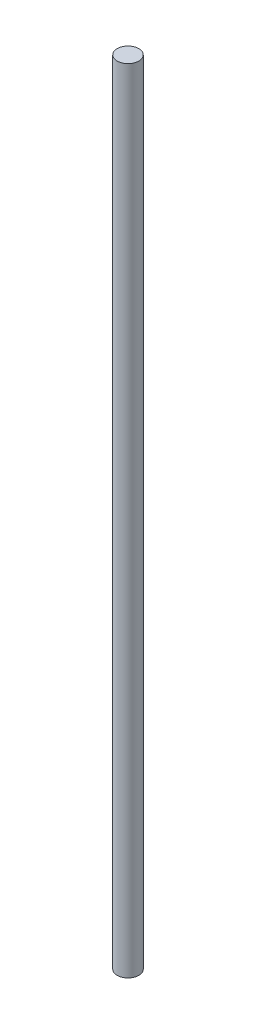
ISO-10303-21;
HEADER;
FILE_DESCRIPTION(('STEP AP214'),'2;1');
FILE_NAME('part.step','',(''),(''),'','','');
FILE_SCHEMA(('AUTOMOTIVE_DESIGN { 1 0 10303 214 1 1 1 1 }'));
ENDSEC;
DATA;
#1=APPLICATION_CONTEXT('core data for automotive mechanical design processes');
#2=APPLICATION_PROTOCOL_DEFINITION('international standard','automotive_design',2000,#1);
#3=PRODUCT_CONTEXT('',#1,'mechanical');
#4=PRODUCT('Part','Part','',(#3));
#5=PRODUCT_RELATED_PRODUCT_CATEGORY('part','',(#4));
#6=PRODUCT_DEFINITION_FORMATION('','',#4);
#7=PRODUCT_DEFINITION_CONTEXT('part definition',#1,'design');
#8=PRODUCT_DEFINITION('design','',#6,#7);
#9=PRODUCT_DEFINITION_SHAPE('','',#8);
#10=(LENGTH_UNIT() NAMED_UNIT(*) SI_UNIT(.MILLI.,.METRE.));
#11=(NAMED_UNIT(*) PLANE_ANGLE_UNIT() SI_UNIT($,.RADIAN.));
#12=(NAMED_UNIT(*) SI_UNIT($,.STERADIAN.) SOLID_ANGLE_UNIT());
#13=UNCERTAINTY_MEASURE_WITH_UNIT(LENGTH_MEASURE(1.E-05),#10,'distance_accuracy_value','');
#14=(GEOMETRIC_REPRESENTATION_CONTEXT(3) GLOBAL_UNCERTAINTY_ASSIGNED_CONTEXT((#13)) GLOBAL_UNIT_ASSIGNED_CONTEXT((#10,
#11,#12)) REPRESENTATION_CONTEXT('',''));
#15=CARTESIAN_POINT('',(0.,0.,0.));
#16=DIRECTION('',(0.,0.,1.));
#17=DIRECTION('',(1.,0.,0.));
#18=AXIS2_PLACEMENT_3D('',#15,#16,#17);
#19=CARTESIAN_POINT('',(0.,220.,0.));
#20=DIRECTION('',(0.,-1.,0.));
#21=DIRECTION('',(0.,0.,-1.));
#22=AXIS2_PLACEMENT_3D('',#19,#20,#21);
#23=CYLINDRICAL_SURFACE('',#22,3.);
#24=CARTESIAN_POINT('',(0.,220.,0.));
#25=DIRECTION('',(0.,1.,0.));
#26=DIRECTION('',(0.,0.,1.));
#27=AXIS2_PLACEMENT_3D('',#24,#25,#26);
#28=CIRCLE('',#27,3.);
#29=CARTESIAN_POINT('',(0.,220.,3.));
#30=VERTEX_POINT('',#29);
#31=EDGE_CURVE('E10',#30,#30,#28,.T.);
#32=ORIENTED_EDGE('',*,*,#31,.F.);
#33=EDGE_LOOP('',(#32));
#34=FACE_BOUND('',#33,.T.);
#35=CARTESIAN_POINT('',(0.,0.,0.));
#36=DIRECTION('',(0.,1.,0.));
#37=DIRECTION('',(0.,0.,1.));
#38=AXIS2_PLACEMENT_3D('',#35,#36,#37);
#39=CIRCLE('',#38,3.);
#40=CARTESIAN_POINT('',(0.,0.,3.));
#41=VERTEX_POINT('',#40);
#42=EDGE_CURVE('E46',#41,#41,#39,.T.);
#43=ORIENTED_EDGE('',*,*,#42,.T.);
#44=EDGE_LOOP('',(#43));
#45=FACE_BOUND('',#44,.T.);
#46=ADVANCED_FACE('F43',(#34,#45),#23,.T.);
#47=CARTESIAN_POINT('',(0.,220.,0.));
#48=DIRECTION('',(0.,1.,0.));
#49=DIRECTION('',(0.,0.,1.));
#50=AXIS2_PLACEMENT_3D('',#47,#48,#49);
#51=PLANE('',#50);
#52=ORIENTED_EDGE('',*,*,#31,.T.);
#53=EDGE_LOOP('',(#52));
#54=FACE_BOUND('',#53,.T.);
#55=ADVANCED_FACE('F58',(#54),#51,.T.);
#56=CARTESIAN_POINT('',(0.,0.,0.));
#57=DIRECTION('',(0.,1.,0.));
#58=DIRECTION('',(0.,0.,1.));
#59=AXIS2_PLACEMENT_3D('',#56,#57,#58);
#60=PLANE('',#59);
#61=ORIENTED_EDGE('',*,*,#42,.F.);
#62=EDGE_LOOP('',(#61));
#63=FACE_BOUND('',#62,.T.);
#64=ADVANCED_FACE('F59',(#63),#60,.F.);
#65=CLOSED_SHELL('',(#46,#55,#64));
#66=MANIFOLD_SOLID_BREP('B2',#65);
#67=ADVANCED_BREP_SHAPE_REPRESENTATION('',(#18,#66),#14);
#68=SHAPE_DEFINITION_REPRESENTATION(#9,#67);
ENDSEC;
END-ISO-10303-21;
